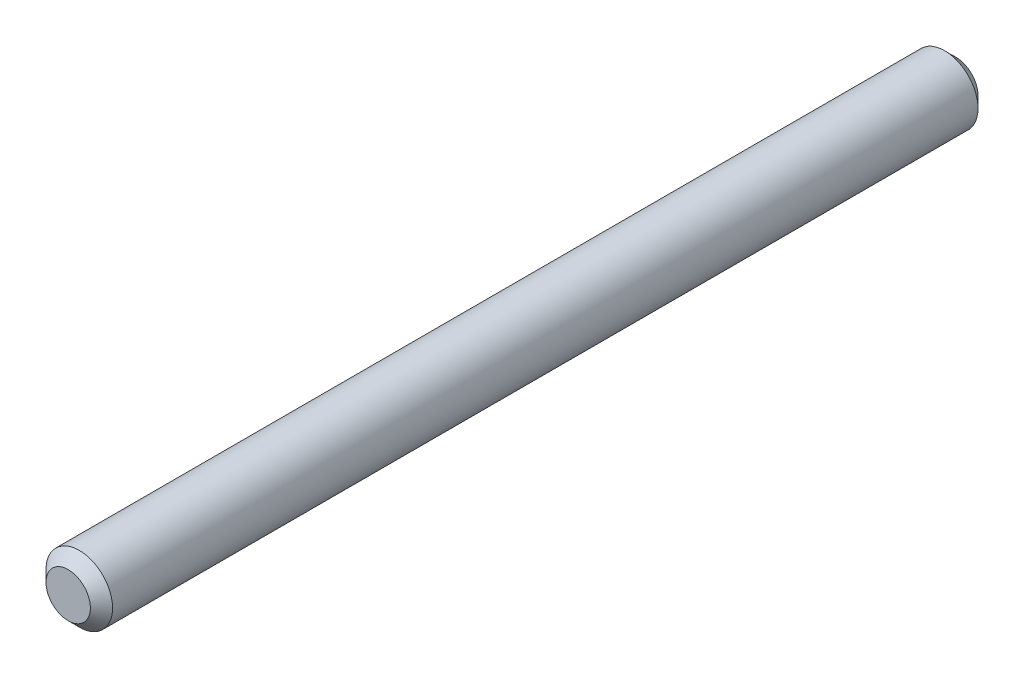
ISO-10303-21;
HEADER;
FILE_DESCRIPTION(('STEP AP214'),'2;1');
FILE_NAME('part.step','',(''),(''),'','','');
FILE_SCHEMA(('AUTOMOTIVE_DESIGN { 1 0 10303 214 1 1 1 1 }'));
ENDSEC;
DATA;
#1=APPLICATION_CONTEXT('core data for automotive mechanical design processes');
#2=APPLICATION_PROTOCOL_DEFINITION('international standard','automotive_design',2000,#1);
#3=PRODUCT_CONTEXT('',#1,'mechanical');
#4=PRODUCT('Part','Part','',(#3));
#5=PRODUCT_RELATED_PRODUCT_CATEGORY('part','',(#4));
#6=PRODUCT_DEFINITION_FORMATION('','',#4);
#7=PRODUCT_DEFINITION_CONTEXT('part definition',#1,'design');
#8=PRODUCT_DEFINITION('design','',#6,#7);
#9=PRODUCT_DEFINITION_SHAPE('','',#8);
#10=(LENGTH_UNIT() NAMED_UNIT(*) SI_UNIT(.MILLI.,.METRE.));
#11=(NAMED_UNIT(*) PLANE_ANGLE_UNIT() SI_UNIT($,.RADIAN.));
#12=(NAMED_UNIT(*) SI_UNIT($,.STERADIAN.) SOLID_ANGLE_UNIT());
#13=UNCERTAINTY_MEASURE_WITH_UNIT(LENGTH_MEASURE(1.E-05),#10,'distance_accuracy_value','');
#14=(GEOMETRIC_REPRESENTATION_CONTEXT(3) GLOBAL_UNCERTAINTY_ASSIGNED_CONTEXT((#13)) GLOBAL_UNIT_ASSIGNED_CONTEXT((#10,
#11,#12)) REPRESENTATION_CONTEXT('',''));
#15=CARTESIAN_POINT('',(0.,0.,0.));
#16=DIRECTION('',(0.,0.,1.));
#17=DIRECTION('',(1.,0.,0.));
#18=AXIS2_PLACEMENT_3D('',#15,#16,#17);
#19=CARTESIAN_POINT('',(0.,0.,40.));
#20=DIRECTION('',(0.,0.,-1.));
#21=DIRECTION('',(-1.,0.,0.));
#22=AXIS2_PLACEMENT_3D('',#19,#20,#21);
#23=CYLINDRICAL_SURFACE('',#22,3.);
#24=CARTESIAN_POINT('',(0.,0.,-39.));
#25=DIRECTION('',(0.,0.,1.));
#26=DIRECTION('',(1.,0.,0.));
#27=AXIS2_PLACEMENT_3D('',#24,#25,#26);
#28=CIRCLE('',#27,3.);
#29=CARTESIAN_POINT('',(3.,0.,-39.));
#30=VERTEX_POINT('',#29);
#31=EDGE_CURVE('E42',#30,#30,#28,.T.);
#32=ORIENTED_EDGE('',*,*,#31,.T.);
#33=EDGE_LOOP('',(#32));
#34=FACE_BOUND('',#33,.T.);
#35=CARTESIAN_POINT('',(0.,0.,39.));
#36=DIRECTION('',(0.,0.,1.));
#37=DIRECTION('',(1.,0.,0.));
#38=AXIS2_PLACEMENT_3D('',#35,#36,#37);
#39=CIRCLE('',#38,3.);
#40=CARTESIAN_POINT('',(3.,0.,39.));
#41=VERTEX_POINT('',#40);
#42=EDGE_CURVE('E46',#41,#41,#39,.F.);
#43=ORIENTED_EDGE('',*,*,#42,.T.);
#44=EDGE_LOOP('',(#43));
#45=FACE_BOUND('',#44,.T.);
#46=ADVANCED_FACE('F31',(#34,#45),#23,.T.);
#47=CARTESIAN_POINT('',(0.,0.,40.));
#48=DIRECTION('',(0.,0.,1.));
#49=DIRECTION('',(1.,0.,0.));
#50=AXIS2_PLACEMENT_3D('',#47,#48,#49);
#51=PLANE('',#50);
#52=CARTESIAN_POINT('',(0.,0.,40.));
#53=DIRECTION('',(0.,0.,1.));
#54=DIRECTION('',(1.,0.,0.));
#55=AXIS2_PLACEMENT_3D('',#52,#53,#54);
#56=CIRCLE('',#55,1.99999999999999);
#57=CARTESIAN_POINT('',(1.99999999999999,0.,40.));
#58=VERTEX_POINT('',#57);
#59=EDGE_CURVE('E10',#58,#58,#56,.T.);
#60=ORIENTED_EDGE('',*,*,#59,.T.);
#61=EDGE_LOOP('',(#60));
#62=FACE_BOUND('',#61,.T.);
#63=ADVANCED_FACE('F62',(#62),#51,.T.);
#64=CARTESIAN_POINT('',(0.,0.,-40.));
#65=DIRECTION('',(0.,0.,1.));
#66=DIRECTION('',(1.,0.,0.));
#67=AXIS2_PLACEMENT_3D('',#64,#65,#66);
#68=PLANE('',#67);
#69=CARTESIAN_POINT('',(0.,0.,-40.));
#70=DIRECTION('',(0.,0.,1.));
#71=DIRECTION('',(1.,0.,0.));
#72=AXIS2_PLACEMENT_3D('',#69,#70,#71);
#73=CIRCLE('',#72,2.);
#74=CARTESIAN_POINT('',(2.,0.,-40.));
#75=VERTEX_POINT('',#74);
#76=EDGE_CURVE('E38',#75,#75,#73,.F.);
#77=ORIENTED_EDGE('',*,*,#76,.T.);
#78=EDGE_LOOP('',(#77));
#79=FACE_BOUND('',#78,.T.);
#80=ADVANCED_FACE('F59',(#79),#68,.F.);
#81=CARTESIAN_POINT('',(0.,0.,-39.));
#82=DIRECTION('',(0.,0.,1.));
#83=DIRECTION('',(1.,0.,0.));
#84=AXIS2_PLACEMENT_3D('',#81,#82,#83);
#85=CONICAL_SURFACE('',#84,3.,0.785398163397454);
#86=ORIENTED_EDGE('',*,*,#76,.F.);
#87=EDGE_LOOP('',(#86));
#88=FACE_BOUND('',#87,.T.);
#89=ORIENTED_EDGE('',*,*,#31,.F.);
#90=EDGE_LOOP('',(#89));
#91=FACE_BOUND('',#90,.T.);
#92=ADVANCED_FACE('F55',(#88,#91),#85,.T.);
#93=CARTESIAN_POINT('',(0.,0.,40.));
#94=DIRECTION('',(0.,0.,-1.));
#95=DIRECTION('',(-1.,0.,0.));
#96=AXIS2_PLACEMENT_3D('',#93,#94,#95);
#97=CONICAL_SURFACE('',#96,1.99999999999999,0.785398163397447);
#98=ORIENTED_EDGE('',*,*,#42,.F.);
#99=EDGE_LOOP('',(#98));
#100=FACE_BOUND('',#99,.T.);
#101=ORIENTED_EDGE('',*,*,#59,.F.);
#102=EDGE_LOOP('',(#101));
#103=FACE_BOUND('',#102,.T.);
#104=ADVANCED_FACE('F33',(#100,#103),#97,.T.);
#105=CLOSED_SHELL('',(#46,#63,#80,#92,#104));
#106=MANIFOLD_SOLID_BREP('B2',#105);
#107=ADVANCED_BREP_SHAPE_REPRESENTATION('',(#18,#106),#14);
#108=SHAPE_DEFINITION_REPRESENTATION(#9,#107);
ENDSEC;
END-ISO-10303-21;
